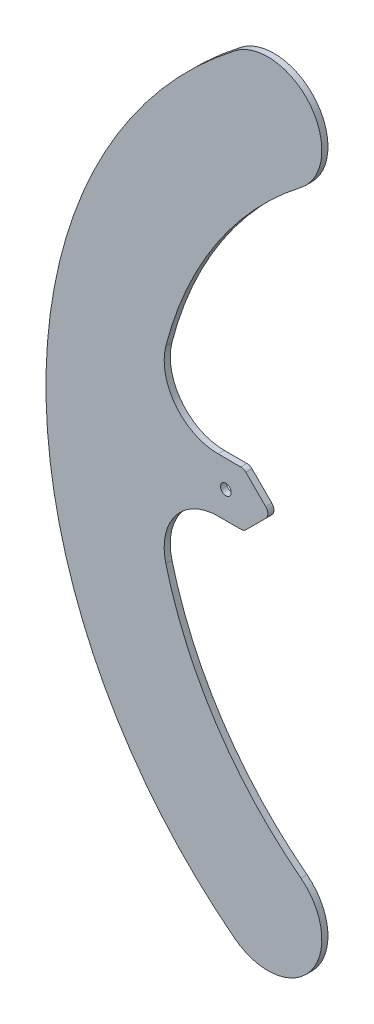
ISO-10303-21;
HEADER;
FILE_DESCRIPTION(('STEP AP214'),'2;1');
FILE_NAME('part.step','',(''),(''),'','','');
FILE_SCHEMA(('AUTOMOTIVE_DESIGN { 1 0 10303 214 1 1 1 1 }'));
ENDSEC;
DATA;
#1=APPLICATION_CONTEXT('core data for automotive mechanical design processes');
#2=APPLICATION_PROTOCOL_DEFINITION('international standard','automotive_design',2000,#1);
#3=PRODUCT_CONTEXT('',#1,'mechanical');
#4=PRODUCT('Part','Part','',(#3));
#5=PRODUCT_RELATED_PRODUCT_CATEGORY('part','',(#4));
#6=PRODUCT_DEFINITION_FORMATION('','',#4);
#7=PRODUCT_DEFINITION_CONTEXT('part definition',#1,'design');
#8=PRODUCT_DEFINITION('design','',#6,#7);
#9=PRODUCT_DEFINITION_SHAPE('','',#8);
#10=(LENGTH_UNIT() NAMED_UNIT(*) SI_UNIT(.MILLI.,.METRE.));
#11=(NAMED_UNIT(*) PLANE_ANGLE_UNIT() SI_UNIT($,.RADIAN.));
#12=(NAMED_UNIT(*) SI_UNIT($,.STERADIAN.) SOLID_ANGLE_UNIT());
#13=UNCERTAINTY_MEASURE_WITH_UNIT(LENGTH_MEASURE(1.E-05),#10,'distance_accuracy_value','');
#14=(GEOMETRIC_REPRESENTATION_CONTEXT(3) GLOBAL_UNCERTAINTY_ASSIGNED_CONTEXT((#13)) GLOBAL_UNIT_ASSIGNED_CONTEXT((#10,
#11,#12)) REPRESENTATION_CONTEXT('',''));
#15=CARTESIAN_POINT('',(0.,0.,0.));
#16=DIRECTION('',(0.,0.,1.));
#17=DIRECTION('',(1.,0.,0.));
#18=AXIS2_PLACEMENT_3D('',#15,#16,#17);
#19=CARTESIAN_POINT('',(0.,-7.5,1.7));
#20=DIRECTION('',(0.,-1.,0.));
#21=DIRECTION('',(1.,0.,0.));
#22=AXIS2_PLACEMENT_3D('',#19,#20,#21);
#23=PLANE('',#22);
#24=DIRECTION('',(-1.,0.,0.));
#25=VECTOR('',#24,1.);
#26=CARTESIAN_POINT('',(0.,-7.5,0.));
#27=LINE('',#26,#25);
#28=CARTESIAN_POINT('',(-10.3284271247462,-7.5,0.));
#29=VERTEX_POINT('',#28);
#30=CARTESIAN_POINT('',(-16.6421252896669,-7.5,0.));
#31=VERTEX_POINT('',#30);
#32=EDGE_CURVE('E182',#29,#31,#27,.T.);
#33=ORIENTED_EDGE('',*,*,#32,.F.);
#34=DIRECTION('',(0.,0.,-1.));
#35=VECTOR('',#34,1.);
#36=CARTESIAN_POINT('',(-10.3284271247462,-7.5,1.7));
#37=LINE('',#36,#35);
#38=CARTESIAN_POINT('',(-10.3284271247462,-7.5,1.7));
#39=VERTEX_POINT('',#38);
#40=EDGE_CURVE('E238',#29,#39,#37,.F.);
#41=ORIENTED_EDGE('',*,*,#40,.T.);
#42=DIRECTION('',(-1.,0.,0.));
#43=VECTOR('',#42,1.);
#44=CARTESIAN_POINT('',(0.,-7.5,1.7));
#45=LINE('',#44,#43);
#46=CARTESIAN_POINT('',(-16.6421252896669,-7.5,1.7));
#47=VERTEX_POINT('',#46);
#48=EDGE_CURVE('E204',#39,#47,#45,.T.);
#49=ORIENTED_EDGE('',*,*,#48,.T.);
#50=DIRECTION('',(0.,0.,1.));
#51=VECTOR('',#50,1.);
#52=CARTESIAN_POINT('',(-16.6421252896669,-7.5,0.));
#53=LINE('',#52,#51);
#54=EDGE_CURVE('E147',#47,#31,#53,.F.);
#55=ORIENTED_EDGE('',*,*,#54,.T.);
#56=EDGE_LOOP('',(#33,#41,#49,#55));
#57=FACE_BOUND('',#56,.T.);
#58=ADVANCED_FACE('F35',(#57),#23,.T.);
#59=CARTESIAN_POINT('',(-1.00000000000005,1.00000000000004,1.7));
#60=DIRECTION('',(-0.707106781186551,0.707106781186544,0.));
#61=DIRECTION('',(-0.707106781186544,-0.707106781186551,0.));
#62=AXIS2_PLACEMENT_3D('',#59,#60,#61);
#63=PLANE('',#62);
#64=DIRECTION('',(0.707106781186544,0.707106781186551,0.));
#65=VECTOR('',#64,1.);
#66=CARTESIAN_POINT('',(-1.00000000000005,1.00000000000004,1.7));
#67=LINE('',#66,#65);
#68=CARTESIAN_POINT('',(-8.9142135623731,-6.91421356237309,1.7));
#69=VERTEX_POINT('',#68);
#70=CARTESIAN_POINT('',(-3.41421356237315,-1.41421356237309,1.7));
#71=VERTEX_POINT('',#70);
#72=EDGE_CURVE('E280',#69,#71,#67,.T.);
#73=ORIENTED_EDGE('',*,*,#72,.F.);
#74=DIRECTION('',(0.,0.,-1.));
#75=VECTOR('',#74,1.);
#76=CARTESIAN_POINT('',(-8.9142135623731,-6.91421356237309,0.));
#77=LINE('',#76,#75);
#78=CARTESIAN_POINT('',(-8.9142135623731,-6.91421356237309,0.));
#79=VERTEX_POINT('',#78);
#80=EDGE_CURVE('E229',#69,#79,#77,.T.);
#81=ORIENTED_EDGE('',*,*,#80,.T.);
#82=DIRECTION('',(0.707106781186544,0.707106781186551,0.));
#83=VECTOR('',#82,1.);
#84=CARTESIAN_POINT('',(-1.00000000000005,1.00000000000004,0.));
#85=LINE('',#84,#83);
#86=CARTESIAN_POINT('',(-3.41421356237315,-1.41421356237309,0.));
#87=VERTEX_POINT('',#86);
#88=EDGE_CURVE('E184',#79,#87,#85,.T.);
#89=ORIENTED_EDGE('',*,*,#88,.T.);
#90=DIRECTION('',(0.,0.,-1.));
#91=VECTOR('',#90,1.);
#92=CARTESIAN_POINT('',(-3.41421356237315,-1.41421356237309,1.7));
#93=LINE('',#92,#91);
#94=EDGE_CURVE('E227',#87,#71,#93,.F.);
#95=ORIENTED_EDGE('',*,*,#94,.T.);
#96=EDGE_LOOP('',(#73,#81,#89,#95));
#97=FACE_BOUND('',#96,.T.);
#98=ADVANCED_FACE('F288',(#97),#63,.F.);
#99=CARTESIAN_POINT('',(-1.00000000000005,-1.00000000000004,1.7));
#100=DIRECTION('',(-0.707106781186551,-0.707106781186544,0.));
#101=DIRECTION('',(0.707106781186544,-0.707106781186551,0.));
#102=AXIS2_PLACEMENT_3D('',#99,#100,#101);
#103=PLANE('',#102);
#104=DIRECTION('',(-0.707106781186544,0.707106781186551,0.));
#105=VECTOR('',#104,1.);
#106=CARTESIAN_POINT('',(-1.00000000000005,-1.00000000000004,0.));
#107=LINE('',#106,#105);
#108=CARTESIAN_POINT('',(-3.41421356237315,1.41421356237309,0.));
#109=VERTEX_POINT('',#108);
#110=CARTESIAN_POINT('',(-8.9142135623731,6.91421356237309,0.));
#111=VERTEX_POINT('',#110);
#112=EDGE_CURVE('E187',#109,#111,#107,.T.);
#113=ORIENTED_EDGE('',*,*,#112,.T.);
#114=DIRECTION('',(0.,0.,-1.));
#115=VECTOR('',#114,1.);
#116=CARTESIAN_POINT('',(-8.9142135623731,6.91421356237309,1.7));
#117=LINE('',#116,#115);
#118=CARTESIAN_POINT('',(-8.9142135623731,6.91421356237309,1.7));
#119=VERTEX_POINT('',#118);
#120=EDGE_CURVE('E11',#111,#119,#117,.F.);
#121=ORIENTED_EDGE('',*,*,#120,.T.);
#122=DIRECTION('',(-0.707106781186544,0.707106781186551,0.));
#123=VECTOR('',#122,1.);
#124=CARTESIAN_POINT('',(-1.00000000000005,-1.00000000000004,1.7));
#125=LINE('',#124,#123);
#126=CARTESIAN_POINT('',(-3.41421356237315,1.41421356237309,1.7));
#127=VERTEX_POINT('',#126);
#128=EDGE_CURVE('E165',#127,#119,#125,.T.);
#129=ORIENTED_EDGE('',*,*,#128,.F.);
#130=DIRECTION('',(0.,0.,-1.));
#131=VECTOR('',#130,1.);
#132=CARTESIAN_POINT('',(-3.41421356237315,1.41421356237309,1.7));
#133=LINE('',#132,#131);
#134=EDGE_CURVE('E43',#127,#109,#133,.T.);
#135=ORIENTED_EDGE('',*,*,#134,.T.);
#136=EDGE_LOOP('',(#113,#121,#129,#135));
#137=FACE_BOUND('',#136,.T.);
#138=ADVANCED_FACE('F250',(#137),#103,.F.);
#139=CARTESIAN_POINT('',(0.,7.50000000000001,1.7));
#140=DIRECTION('',(0.,-1.,0.));
#141=DIRECTION('',(1.,0.,0.));
#142=AXIS2_PLACEMENT_3D('',#139,#140,#141);
#143=PLANE('',#142);
#144=DIRECTION('',(-1.,0.,0.));
#145=VECTOR('',#144,1.);
#146=CARTESIAN_POINT('',(0.,7.50000000000001,1.7));
#147=LINE('',#146,#145);
#148=CARTESIAN_POINT('',(-10.3284271247462,7.5,1.7));
#149=VERTEX_POINT('',#148);
#150=CARTESIAN_POINT('',(-16.6421252896669,7.5,1.7));
#151=VERTEX_POINT('',#150);
#152=EDGE_CURVE('E162',#149,#151,#147,.T.);
#153=ORIENTED_EDGE('',*,*,#152,.F.);
#154=DIRECTION('',(0.,0.,-1.));
#155=VECTOR('',#154,1.);
#156=CARTESIAN_POINT('',(-10.3284271247462,7.5,1.7));
#157=LINE('',#156,#155);
#158=CARTESIAN_POINT('',(-10.3284271247462,7.5,0.));
#159=VERTEX_POINT('',#158);
#160=EDGE_CURVE('E245',#149,#159,#157,.T.);
#161=ORIENTED_EDGE('',*,*,#160,.T.);
#162=DIRECTION('',(-1.,0.,0.));
#163=VECTOR('',#162,1.);
#164=CARTESIAN_POINT('',(0.,7.50000000000001,0.));
#165=LINE('',#164,#163);
#166=CARTESIAN_POINT('',(-16.6421252896669,7.5,0.));
#167=VERTEX_POINT('',#166);
#168=EDGE_CURVE('E189',#159,#167,#165,.T.);
#169=ORIENTED_EDGE('',*,*,#168,.T.);
#170=DIRECTION('',(0.,0.,-1.));
#171=VECTOR('',#170,1.);
#172=CARTESIAN_POINT('',(-16.6421252896669,7.5,1.7));
#173=LINE('',#172,#171);
#174=EDGE_CURVE('E215',#167,#151,#173,.F.);
#175=ORIENTED_EDGE('',*,*,#174,.T.);
#176=EDGE_LOOP('',(#153,#161,#169,#175));
#177=FACE_BOUND('',#176,.T.);
#178=ADVANCED_FACE('F262',(#177),#143,.F.);
#179=CARTESIAN_POINT('',(70.5,0.,1.7));
#180=DIRECTION('',(0.,0.,-1.));
#181=DIRECTION('',(-1.,0.,0.));
#182=AXIS2_PLACEMENT_3D('',#179,#180,#181);
#183=CYLINDRICAL_SURFACE('',#182,105.);
#184=CARTESIAN_POINT('',(70.5,0.,1.7));
#185=DIRECTION('',(0.,0.,1.));
#186=DIRECTION('',(1.,0.,0.));
#187=AXIS2_PLACEMENT_3D('',#184,#185,#186);
#188=CIRCLE('',#187,105.);
#189=CARTESIAN_POINT('',(6.34990744355858,83.125,1.7));
#190=VERTEX_POINT('',#189);
#191=CARTESIAN_POINT('',(-31.1658128379447,26.25,1.7));
#192=VERTEX_POINT('',#191);
#193=EDGE_CURVE('E141',#190,#192,#188,.T.);
#194=ORIENTED_EDGE('',*,*,#193,.T.);
#195=DIRECTION('',(0.,0.,-1.));
#196=VECTOR('',#195,1.);
#197=CARTESIAN_POINT('',(-31.1658128379447,26.25,1.7));
#198=LINE('',#197,#196);
#199=CARTESIAN_POINT('',(-31.1658128379447,26.25,0.));
#200=VERTEX_POINT('',#199);
#201=EDGE_CURVE('E213',#192,#200,#198,.T.);
#202=ORIENTED_EDGE('',*,*,#201,.T.);
#203=CARTESIAN_POINT('',(70.5,0.,0.));
#204=DIRECTION('',(0.,0.,1.));
#205=DIRECTION('',(1.,0.,0.));
#206=AXIS2_PLACEMENT_3D('',#203,#204,#205);
#207=CIRCLE('',#206,105.);
#208=CARTESIAN_POINT('',(6.34990744355858,83.125,0.));
#209=VERTEX_POINT('',#208);
#210=EDGE_CURVE('E144',#209,#200,#207,.T.);
#211=ORIENTED_EDGE('',*,*,#210,.F.);
#212=DIRECTION('',(0.,0.,-1.));
#213=VECTOR('',#212,1.);
#214=CARTESIAN_POINT('',(6.34990744355858,83.125,1.7));
#215=LINE('',#214,#213);
#216=EDGE_CURVE('E136',#190,#209,#215,.T.);
#217=ORIENTED_EDGE('',*,*,#216,.F.);
#218=EDGE_LOOP('',(#194,#202,#211,#217));
#219=FACE_BOUND('',#218,.T.);
#220=ADVANCED_FACE('F138',(#219),#183,.F.);
#221=CARTESIAN_POINT('',(-2.81439149307591,95.,1.7));
#222=DIRECTION('',(0.,0.,-1.));
#223=DIRECTION('',(-1.,0.,0.));
#224=AXIS2_PLACEMENT_3D('',#221,#222,#223);
#225=CYLINDRICAL_SURFACE('',#224,15.);
#226=CARTESIAN_POINT('',(-2.81439149307591,95.,0.));
#227=DIRECTION('',(0.,0.,1.));
#228=DIRECTION('',(1.,0.,0.));
#229=AXIS2_PLACEMENT_3D('',#226,#227,#228);
#230=CIRCLE('',#229,15.);
#231=CARTESIAN_POINT('',(-11.9786904297104,106.875,0.));
#232=VERTEX_POINT('',#231);
#233=EDGE_CURVE('E192',#209,#232,#230,.T.);
#234=ORIENTED_EDGE('',*,*,#233,.T.);
#235=DIRECTION('',(0.,0.,-1.));
#236=VECTOR('',#235,1.);
#237=CARTESIAN_POINT('',(-11.9786904297104,106.875,1.7));
#238=LINE('',#237,#236);
#239=CARTESIAN_POINT('',(-11.9786904297104,106.875,1.7));
#240=VERTEX_POINT('',#239);
#241=EDGE_CURVE('E148',#240,#232,#238,.T.);
#242=ORIENTED_EDGE('',*,*,#241,.F.);
#243=CARTESIAN_POINT('',(-2.81439149307591,95.,1.7));
#244=DIRECTION('',(0.,0.,1.));
#245=DIRECTION('',(1.,0.,0.));
#246=AXIS2_PLACEMENT_3D('',#243,#244,#245);
#247=CIRCLE('',#246,15.);
#248=EDGE_CURVE('E151',#190,#240,#247,.T.);
#249=ORIENTED_EDGE('',*,*,#248,.F.);
#250=ORIENTED_EDGE('',*,*,#216,.T.);
#251=EDGE_LOOP('',(#234,#242,#249,#250));
#252=FACE_BOUND('',#251,.T.);
#253=ADVANCED_FACE('F152',(#252),#225,.T.);
#254=CARTESIAN_POINT('',(70.5,0.,1.7));
#255=DIRECTION('',(0.,0.,-1.));
#256=DIRECTION('',(-1.,0.,0.));
#257=AXIS2_PLACEMENT_3D('',#254,#255,#256);
#258=CYLINDRICAL_SURFACE('',#257,135.);
#259=CARTESIAN_POINT('',(70.5,0.,0.));
#260=DIRECTION('',(0.,0.,1.));
#261=DIRECTION('',(1.,0.,0.));
#262=AXIS2_PLACEMENT_3D('',#259,#260,#261);
#263=CIRCLE('',#262,135.);
#264=CARTESIAN_POINT('',(-11.9786904297104,-106.875,0.));
#265=VERTEX_POINT('',#264);
#266=EDGE_CURVE('E195',#232,#265,#263,.T.);
#267=ORIENTED_EDGE('',*,*,#266,.T.);
#268=DIRECTION('',(0.,0.,-1.));
#269=VECTOR('',#268,1.);
#270=CARTESIAN_POINT('',(-11.9786904297104,-106.875,1.7));
#271=LINE('',#270,#269);
#272=CARTESIAN_POINT('',(-11.9786904297104,-106.875,1.7));
#273=VERTEX_POINT('',#272);
#274=EDGE_CURVE('E206',#273,#265,#271,.T.);
#275=ORIENTED_EDGE('',*,*,#274,.F.);
#276=CARTESIAN_POINT('',(70.5,0.,1.7));
#277=DIRECTION('',(0.,0.,1.));
#278=DIRECTION('',(1.,0.,0.));
#279=AXIS2_PLACEMENT_3D('',#276,#277,#278);
#280=CIRCLE('',#279,135.);
#281=EDGE_CURVE('E155',#240,#273,#280,.T.);
#282=ORIENTED_EDGE('',*,*,#281,.F.);
#283=ORIENTED_EDGE('',*,*,#241,.T.);
#284=EDGE_LOOP('',(#267,#275,#282,#283));
#285=FACE_BOUND('',#284,.T.);
#286=ADVANCED_FACE('F268',(#285),#258,.T.);
#287=CARTESIAN_POINT('',(-2.81439149307591,-95.,1.7));
#288=DIRECTION('',(0.,0.,-1.));
#289=DIRECTION('',(-1.,0.,0.));
#290=AXIS2_PLACEMENT_3D('',#287,#288,#289);
#291=CYLINDRICAL_SURFACE('',#290,15.);
#292=CARTESIAN_POINT('',(-2.81439149307591,-95.,0.));
#293=DIRECTION('',(0.,0.,1.));
#294=DIRECTION('',(1.,0.,0.));
#295=AXIS2_PLACEMENT_3D('',#292,#293,#294);
#296=CIRCLE('',#295,15.);
#297=CARTESIAN_POINT('',(6.34990744355858,-83.125,0.));
#298=VERTEX_POINT('',#297);
#299=EDGE_CURVE('E198',#298,#265,#296,.F.);
#300=ORIENTED_EDGE('',*,*,#299,.F.);
#301=DIRECTION('',(0.,0.,-1.));
#302=VECTOR('',#301,1.);
#303=CARTESIAN_POINT('',(6.34990744355858,-83.125,1.7));
#304=LINE('',#303,#302);
#305=CARTESIAN_POINT('',(6.34990744355858,-83.125,1.7));
#306=VERTEX_POINT('',#305);
#307=EDGE_CURVE('E174',#306,#298,#304,.T.);
#308=ORIENTED_EDGE('',*,*,#307,.F.);
#309=CARTESIAN_POINT('',(-2.81439149307591,-95.,1.7));
#310=DIRECTION('',(0.,0.,1.));
#311=DIRECTION('',(1.,0.,0.));
#312=AXIS2_PLACEMENT_3D('',#309,#310,#311);
#313=CIRCLE('',#312,15.);
#314=EDGE_CURVE('E168',#306,#273,#313,.F.);
#315=ORIENTED_EDGE('',*,*,#314,.T.);
#316=ORIENTED_EDGE('',*,*,#274,.T.);
#317=EDGE_LOOP('',(#300,#308,#315,#316));
#318=FACE_BOUND('',#317,.T.);
#319=ADVANCED_FACE('F324',(#318),#291,.T.);
#320=CARTESIAN_POINT('',(-31.1658128379447,-26.25,0.));
#321=VERTEX_POINT('',#320);
#322=EDGE_CURVE('E193',#321,#298,#207,.T.);
#323=ORIENTED_EDGE('',*,*,#322,.F.);
#324=DIRECTION('',(0.,0.,-1.));
#325=VECTOR('',#324,1.);
#326=CARTESIAN_POINT('',(-31.1658128379447,-26.25,1.7));
#327=LINE('',#326,#325);
#328=CARTESIAN_POINT('',(-31.1658128379447,-26.25,1.7));
#329=VERTEX_POINT('',#328);
#330=EDGE_CURVE('E211',#321,#329,#327,.F.);
#331=ORIENTED_EDGE('',*,*,#330,.T.);
#332=EDGE_CURVE('E164',#329,#306,#188,.T.);
#333=ORIENTED_EDGE('',*,*,#332,.T.);
#334=ORIENTED_EDGE('',*,*,#307,.T.);
#335=EDGE_LOOP('',(#323,#331,#333,#334));
#336=FACE_BOUND('',#335,.T.);
#337=ADVANCED_FACE('F320',(#336),#183,.F.);
#338=CARTESIAN_POINT('',(-14.5,0.,1.7));
#339=DIRECTION('',(0.,0.,-1.));
#340=DIRECTION('',(-1.,0.,0.));
#341=AXIS2_PLACEMENT_3D('',#338,#339,#340);
#342=CYLINDRICAL_SURFACE('',#341,1.5);
#343=CARTESIAN_POINT('',(-14.5,0.,1.7));
#344=DIRECTION('',(0.,0.,1.));
#345=DIRECTION('',(1.,0.,0.));
#346=AXIS2_PLACEMENT_3D('',#343,#344,#345);
#347=CIRCLE('',#346,1.5);
#348=CARTESIAN_POINT('',(-13.,0.,1.7));
#349=VERTEX_POINT('',#348);
#350=EDGE_CURVE('E167',#349,#349,#347,.T.);
#351=ORIENTED_EDGE('',*,*,#350,.T.);
#352=EDGE_LOOP('',(#351));
#353=FACE_BOUND('',#352,.T.);
#354=CARTESIAN_POINT('',(-14.5,0.,0.));
#355=DIRECTION('',(0.,0.,1.));
#356=DIRECTION('',(1.,0.,0.));
#357=AXIS2_PLACEMENT_3D('',#354,#355,#356);
#358=CIRCLE('',#357,1.5);
#359=CARTESIAN_POINT('',(-13.,0.,0.));
#360=VERTEX_POINT('',#359);
#361=EDGE_CURVE('E201',#360,#360,#358,.T.);
#362=ORIENTED_EDGE('',*,*,#361,.F.);
#363=EDGE_LOOP('',(#362));
#364=FACE_BOUND('',#363,.T.);
#365=ADVANCED_FACE('F315',(#353,#364),#342,.F.);
#366=CARTESIAN_POINT('',(0.,0.,1.7));
#367=DIRECTION('',(0.,0.,1.));
#368=DIRECTION('',(1.,0.,0.));
#369=AXIS2_PLACEMENT_3D('',#366,#367,#368);
#370=PLANE('',#369);
#371=ORIENTED_EDGE('',*,*,#48,.F.);
#372=CARTESIAN_POINT('',(-10.3284271247462,-5.5,1.7));
#373=DIRECTION('',(0.,0.,1.));
#374=DIRECTION('',(1.,0.,0.));
#375=AXIS2_PLACEMENT_3D('',#372,#373,#374);
#376=CIRCLE('',#375,2.);
#377=EDGE_CURVE('E243',#39,#69,#376,.T.);
#378=ORIENTED_EDGE('',*,*,#377,.T.);
#379=ORIENTED_EDGE('',*,*,#72,.T.);
#380=CARTESIAN_POINT('',(-4.82842712474625,0.,1.7));
#381=DIRECTION('',(0.,0.,1.));
#382=DIRECTION('',(1.,0.,0.));
#383=AXIS2_PLACEMENT_3D('',#380,#381,#382);
#384=CIRCLE('',#383,2.);
#385=EDGE_CURVE('E240',#71,#127,#384,.T.);
#386=ORIENTED_EDGE('',*,*,#385,.T.);
#387=ORIENTED_EDGE('',*,*,#128,.T.);
#388=CARTESIAN_POINT('',(-10.3284271247462,5.5,1.7));
#389=DIRECTION('',(0.,0.,1.));
#390=DIRECTION('',(1.,0.,0.));
#391=AXIS2_PLACEMENT_3D('',#388,#389,#390);
#392=CIRCLE('',#391,2.);
#393=EDGE_CURVE('E50',#119,#149,#392,.T.);
#394=ORIENTED_EDGE('',*,*,#393,.T.);
#395=ORIENTED_EDGE('',*,*,#152,.T.);
#396=CARTESIAN_POINT('',(-16.6421252896669,22.5,1.7));
#397=DIRECTION('',(0.,0.,1.));
#398=DIRECTION('',(1.,0.,0.));
#399=AXIS2_PLACEMENT_3D('',#396,#397,#398);
#400=CIRCLE('',#399,15.);
#401=EDGE_CURVE('E161',#151,#192,#400,.F.);
#402=ORIENTED_EDGE('',*,*,#401,.T.);
#403=ORIENTED_EDGE('',*,*,#193,.F.);
#404=ORIENTED_EDGE('',*,*,#248,.T.);
#405=ORIENTED_EDGE('',*,*,#281,.T.);
#406=ORIENTED_EDGE('',*,*,#314,.F.);
#407=ORIENTED_EDGE('',*,*,#332,.F.);
#408=CARTESIAN_POINT('',(-16.6421252896669,-22.5,1.7));
#409=DIRECTION('',(0.,0.,1.));
#410=DIRECTION('',(1.,0.,0.));
#411=AXIS2_PLACEMENT_3D('',#408,#409,#410);
#412=CIRCLE('',#411,15.);
#413=EDGE_CURVE('E220',#329,#47,#412,.F.);
#414=ORIENTED_EDGE('',*,*,#413,.T.);
#415=EDGE_LOOP('',(#371,#378,#379,#386,#387,#394,#395,#402,#403,#404,#405,#406,#407,#414));
#416=FACE_BOUND('',#415,.T.);
#417=ORIENTED_EDGE('',*,*,#350,.F.);
#418=EDGE_LOOP('',(#417));
#419=FACE_BOUND('',#418,.T.);
#420=ADVANCED_FACE('F158',(#416,#419),#370,.T.);
#421=CARTESIAN_POINT('',(0.,0.,0.));
#422=DIRECTION('',(0.,0.,1.));
#423=DIRECTION('',(1.,0.,0.));
#424=AXIS2_PLACEMENT_3D('',#421,#422,#423);
#425=PLANE('',#424);
#426=ORIENTED_EDGE('',*,*,#88,.F.);
#427=CARTESIAN_POINT('',(-10.3284271247462,-5.5,0.));
#428=DIRECTION('',(0.,0.,1.));
#429=DIRECTION('',(1.,0.,0.));
#430=AXIS2_PLACEMENT_3D('',#427,#428,#429);
#431=CIRCLE('',#430,2.);
#432=EDGE_CURVE('E236',#79,#29,#431,.F.);
#433=ORIENTED_EDGE('',*,*,#432,.T.);
#434=ORIENTED_EDGE('',*,*,#32,.T.);
#435=CARTESIAN_POINT('',(-16.6421252896669,-22.5,0.));
#436=DIRECTION('',(0.,0.,1.));
#437=DIRECTION('',(1.,0.,0.));
#438=AXIS2_PLACEMENT_3D('',#435,#436,#437);
#439=CIRCLE('',#438,15.);
#440=EDGE_CURVE('E218',#31,#321,#439,.T.);
#441=ORIENTED_EDGE('',*,*,#440,.T.);
#442=ORIENTED_EDGE('',*,*,#322,.T.);
#443=ORIENTED_EDGE('',*,*,#299,.T.);
#444=ORIENTED_EDGE('',*,*,#266,.F.);
#445=ORIENTED_EDGE('',*,*,#233,.F.);
#446=ORIENTED_EDGE('',*,*,#210,.T.);
#447=CARTESIAN_POINT('',(-16.6421252896669,22.5,0.));
#448=DIRECTION('',(0.,0.,1.));
#449=DIRECTION('',(1.,0.,0.));
#450=AXIS2_PLACEMENT_3D('',#447,#448,#449);
#451=CIRCLE('',#450,15.);
#452=EDGE_CURVE('E223',#200,#167,#451,.T.);
#453=ORIENTED_EDGE('',*,*,#452,.T.);
#454=ORIENTED_EDGE('',*,*,#168,.F.);
#455=CARTESIAN_POINT('',(-10.3284271247462,5.5,0.));
#456=DIRECTION('',(0.,0.,1.));
#457=DIRECTION('',(1.,0.,0.));
#458=AXIS2_PLACEMENT_3D('',#455,#456,#457);
#459=CIRCLE('',#458,2.);
#460=EDGE_CURVE('E234',#159,#111,#459,.F.);
#461=ORIENTED_EDGE('',*,*,#460,.T.);
#462=ORIENTED_EDGE('',*,*,#112,.F.);
#463=CARTESIAN_POINT('',(-4.82842712474625,0.,0.));
#464=DIRECTION('',(0.,0.,1.));
#465=DIRECTION('',(1.,0.,0.));
#466=AXIS2_PLACEMENT_3D('',#463,#464,#465);
#467=CIRCLE('',#466,2.);
#468=EDGE_CURVE('E232',#109,#87,#467,.F.);
#469=ORIENTED_EDGE('',*,*,#468,.T.);
#470=EDGE_LOOP('',(#426,#433,#434,#441,#442,#443,#444,#445,#446,#453,#454,#461,#462,#469));
#471=FACE_BOUND('',#470,.T.);
#472=ORIENTED_EDGE('',*,*,#361,.T.);
#473=EDGE_LOOP('',(#472));
#474=FACE_BOUND('',#473,.T.);
#475=ADVANCED_FACE('F255',(#471,#474),#425,.F.);
#476=CARTESIAN_POINT('',(-16.6421252896669,-22.5,1.7));
#477=DIRECTION('',(0.,0.,-1.));
#478=DIRECTION('',(-1.,0.,0.));
#479=AXIS2_PLACEMENT_3D('',#476,#477,#478);
#480=CYLINDRICAL_SURFACE('',#479,15.);
#481=ORIENTED_EDGE('',*,*,#413,.F.);
#482=ORIENTED_EDGE('',*,*,#330,.F.);
#483=ORIENTED_EDGE('',*,*,#440,.F.);
#484=ORIENTED_EDGE('',*,*,#54,.F.);
#485=EDGE_LOOP('',(#481,#482,#483,#484));
#486=FACE_BOUND('',#485,.T.);
#487=ADVANCED_FACE('F274',(#486),#480,.F.);
#488=CARTESIAN_POINT('',(-16.6421252896669,22.5,1.7));
#489=DIRECTION('',(0.,0.,-1.));
#490=DIRECTION('',(-1.,0.,0.));
#491=AXIS2_PLACEMENT_3D('',#488,#489,#490);
#492=CYLINDRICAL_SURFACE('',#491,15.);
#493=ORIENTED_EDGE('',*,*,#401,.F.);
#494=ORIENTED_EDGE('',*,*,#174,.F.);
#495=ORIENTED_EDGE('',*,*,#452,.F.);
#496=ORIENTED_EDGE('',*,*,#201,.F.);
#497=EDGE_LOOP('',(#493,#494,#495,#496));
#498=FACE_BOUND('',#497,.T.);
#499=ADVANCED_FACE('F265',(#498),#492,.F.);
#500=CARTESIAN_POINT('',(-10.3284271247462,-5.5,1.7));
#501=DIRECTION('',(0.,0.,1.));
#502=DIRECTION('',(1.,0.,0.));
#503=AXIS2_PLACEMENT_3D('',#500,#501,#502);
#504=CYLINDRICAL_SURFACE('',#503,2.);
#505=ORIENTED_EDGE('',*,*,#377,.F.);
#506=ORIENTED_EDGE('',*,*,#40,.F.);
#507=ORIENTED_EDGE('',*,*,#432,.F.);
#508=ORIENTED_EDGE('',*,*,#80,.F.);
#509=EDGE_LOOP('',(#505,#506,#507,#508));
#510=FACE_BOUND('',#509,.T.);
#511=ADVANCED_FACE('F291',(#510),#504,.T.);
#512=CARTESIAN_POINT('',(-10.3284271247462,5.5,1.7));
#513=DIRECTION('',(0.,0.,-1.));
#514=DIRECTION('',(-1.,0.,0.));
#515=AXIS2_PLACEMENT_3D('',#512,#513,#514);
#516=CYLINDRICAL_SURFACE('',#515,2.);
#517=ORIENTED_EDGE('',*,*,#393,.F.);
#518=ORIENTED_EDGE('',*,*,#120,.F.);
#519=ORIENTED_EDGE('',*,*,#460,.F.);
#520=ORIENTED_EDGE('',*,*,#160,.F.);
#521=EDGE_LOOP('',(#517,#518,#519,#520));
#522=FACE_BOUND('',#521,.T.);
#523=ADVANCED_FACE('F260',(#522),#516,.T.);
#524=CARTESIAN_POINT('',(-4.82842712474625,0.,1.7));
#525=DIRECTION('',(0.,0.,-1.));
#526=DIRECTION('',(-1.,0.,0.));
#527=AXIS2_PLACEMENT_3D('',#524,#525,#526);
#528=CYLINDRICAL_SURFACE('',#527,2.);
#529=ORIENTED_EDGE('',*,*,#385,.F.);
#530=ORIENTED_EDGE('',*,*,#94,.F.);
#531=ORIENTED_EDGE('',*,*,#468,.F.);
#532=ORIENTED_EDGE('',*,*,#134,.F.);
#533=EDGE_LOOP('',(#529,#530,#531,#532));
#534=FACE_BOUND('',#533,.T.);
#535=ADVANCED_FACE('F37',(#534),#528,.T.);
#536=CLOSED_SHELL('',(#58,#98,#138,#178,#220,#253,#286,#319,#337,#365,#420,#475,#487,#499,#511,
#523,#535));
#537=MANIFOLD_SOLID_BREP('B2',#536);
#538=ADVANCED_BREP_SHAPE_REPRESENTATION('',(#18,#537),#14);
#539=SHAPE_DEFINITION_REPRESENTATION(#9,#538);
ENDSEC;
END-ISO-10303-21;
